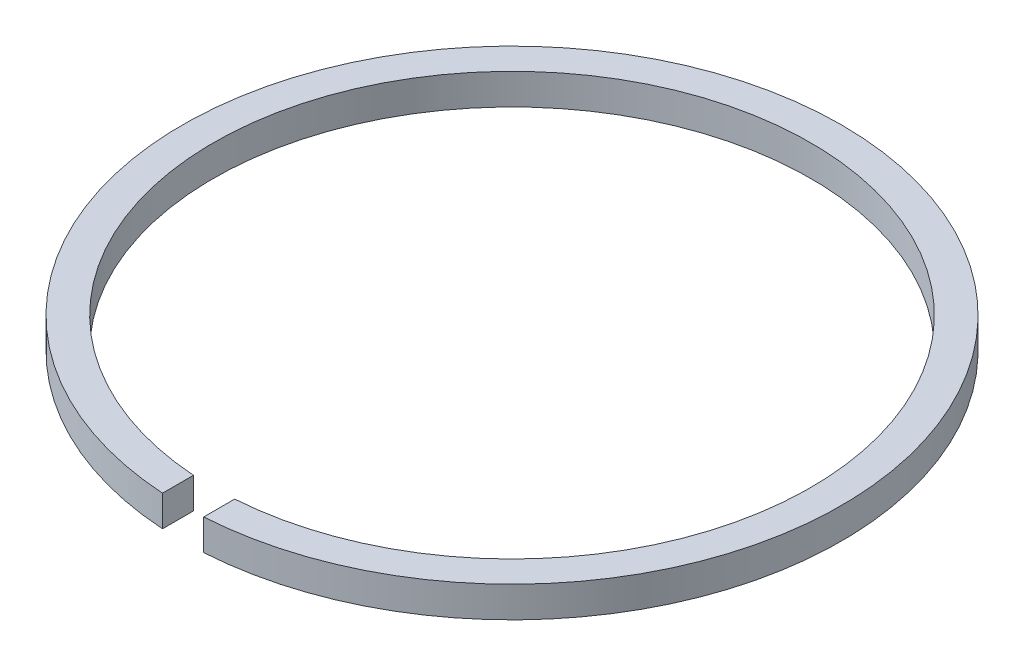
ISO-10303-21;
HEADER;
FILE_DESCRIPTION(('STEP AP214'),'2;1');
FILE_NAME('part.step','',(''),(''),'','','');
FILE_SCHEMA(('AUTOMOTIVE_DESIGN { 1 0 10303 214 1 1 1 1 }'));
ENDSEC;
DATA;
#1=APPLICATION_CONTEXT('core data for automotive mechanical design processes');
#2=APPLICATION_PROTOCOL_DEFINITION('international standard','automotive_design',2000,#1);
#3=PRODUCT_CONTEXT('',#1,'mechanical');
#4=PRODUCT('Part','Part','',(#3));
#5=PRODUCT_RELATED_PRODUCT_CATEGORY('part','',(#4));
#6=PRODUCT_DEFINITION_FORMATION('','',#4);
#7=PRODUCT_DEFINITION_CONTEXT('part definition',#1,'design');
#8=PRODUCT_DEFINITION('design','',#6,#7);
#9=PRODUCT_DEFINITION_SHAPE('','',#8);
#10=(LENGTH_UNIT() NAMED_UNIT(*) SI_UNIT(.MILLI.,.METRE.));
#11=(NAMED_UNIT(*) PLANE_ANGLE_UNIT() SI_UNIT($,.RADIAN.));
#12=(NAMED_UNIT(*) SI_UNIT($,.STERADIAN.) SOLID_ANGLE_UNIT());
#13=UNCERTAINTY_MEASURE_WITH_UNIT(LENGTH_MEASURE(1.E-05),#10,'distance_accuracy_value','');
#14=(GEOMETRIC_REPRESENTATION_CONTEXT(3) GLOBAL_UNCERTAINTY_ASSIGNED_CONTEXT((#13)) GLOBAL_UNIT_ASSIGNED_CONTEXT((#10,
#11,#12)) REPRESENTATION_CONTEXT('',''));
#15=CARTESIAN_POINT('',(0.,0.,0.));
#16=DIRECTION('',(0.,0.,1.));
#17=DIRECTION('',(1.,0.,0.));
#18=AXIS2_PLACEMENT_3D('',#15,#16,#17);
#19=CARTESIAN_POINT('',(0.,1.5,0.));
#20=DIRECTION('',(0.,-1.,0.));
#21=DIRECTION('',(0.,0.,-1.));
#22=AXIS2_PLACEMENT_3D('',#19,#20,#21);
#23=CYLINDRICAL_SURFACE('',#22,14.5);
#24=CARTESIAN_POINT('',(0.,0.,0.));
#25=DIRECTION('',(0.,-1.,0.));
#26=DIRECTION('',(0.,0.,1.));
#27=AXIS2_PLACEMENT_3D('',#24,#25,#26);
#28=CIRCLE('',#27,14.5);
#29=CARTESIAN_POINT('',(-0.999999999999998,0.,14.4654761414894));
#30=VERTEX_POINT('',#29);
#31=CARTESIAN_POINT('',(1.,0.,14.4654761414894));
#32=VERTEX_POINT('',#31);
#33=EDGE_CURVE('E104',#30,#32,#28,.T.);
#34=ORIENTED_EDGE('',*,*,#33,.T.);
#35=DIRECTION('',(0.,-1.,0.));
#36=VECTOR('',#35,1.);
#37=CARTESIAN_POINT('',(1.,1.5,14.4654761414894));
#38=LINE('',#37,#36);
#39=CARTESIAN_POINT('',(1.,1.5,14.4654761414894));
#40=VERTEX_POINT('',#39);
#41=EDGE_CURVE('E11',#40,#32,#38,.T.);
#42=ORIENTED_EDGE('',*,*,#41,.F.);
#43=CARTESIAN_POINT('',(0.,1.5,0.));
#44=DIRECTION('',(0.,-1.,0.));
#45=DIRECTION('',(0.,0.,1.));
#46=AXIS2_PLACEMENT_3D('',#43,#44,#45);
#47=CIRCLE('',#46,14.5);
#48=CARTESIAN_POINT('',(-0.999999999999998,1.5,14.4654761414894));
#49=VERTEX_POINT('',#48);
#50=EDGE_CURVE('E92',#49,#40,#47,.T.);
#51=ORIENTED_EDGE('',*,*,#50,.F.);
#52=DIRECTION('',(0.,-1.,0.));
#53=VECTOR('',#52,1.);
#54=CARTESIAN_POINT('',(-0.999999999999998,1.5,14.4654761414894));
#55=LINE('',#54,#53);
#56=EDGE_CURVE('E100',#49,#30,#55,.T.);
#57=ORIENTED_EDGE('',*,*,#56,.T.);
#58=EDGE_LOOP('',(#34,#42,#51,#57));
#59=FACE_BOUND('',#58,.T.);
#60=ADVANCED_FACE('F41',(#59),#23,.F.);
#61=CARTESIAN_POINT('',(1.,1.5,14.4654761414894));
#62=DIRECTION('',(1.,0.,0.));
#63=DIRECTION('',(0.,0.,-1.));
#64=AXIS2_PLACEMENT_3D('',#61,#62,#63);
#65=PLANE('',#64);
#66=DIRECTION('',(0.,0.,1.));
#67=VECTOR('',#66,1.);
#68=CARTESIAN_POINT('',(1.,0.,14.4654761414894));
#69=LINE('',#68,#67);
#70=CARTESIAN_POINT('',(1.,0.,15.9687194226713));
#71=VERTEX_POINT('',#70);
#72=EDGE_CURVE('E96',#32,#71,#69,.T.);
#73=ORIENTED_EDGE('',*,*,#72,.T.);
#74=DIRECTION('',(0.,-1.,0.));
#75=VECTOR('',#74,1.);
#76=CARTESIAN_POINT('',(1.,1.5,15.9687194226713));
#77=LINE('',#76,#75);
#78=CARTESIAN_POINT('',(1.,1.5,15.9687194226713));
#79=VERTEX_POINT('',#78);
#80=EDGE_CURVE('E49',#79,#71,#77,.T.);
#81=ORIENTED_EDGE('',*,*,#80,.F.);
#82=DIRECTION('',(0.,0.,1.));
#83=VECTOR('',#82,1.);
#84=CARTESIAN_POINT('',(1.,1.5,14.4654761414894));
#85=LINE('',#84,#83);
#86=EDGE_CURVE('E87',#40,#79,#85,.T.);
#87=ORIENTED_EDGE('',*,*,#86,.F.);
#88=ORIENTED_EDGE('',*,*,#41,.T.);
#89=EDGE_LOOP('',(#73,#81,#87,#88));
#90=FACE_BOUND('',#89,.T.);
#91=ADVANCED_FACE('F95',(#90),#65,.F.);
#92=CARTESIAN_POINT('',(0.,1.5,0.));
#93=DIRECTION('',(0.,-1.,0.));
#94=DIRECTION('',(0.,0.,-1.));
#95=AXIS2_PLACEMENT_3D('',#92,#93,#94);
#96=CYLINDRICAL_SURFACE('',#95,16.);
#97=CARTESIAN_POINT('',(0.,0.,0.));
#98=DIRECTION('',(0.,1.,0.));
#99=DIRECTION('',(0.,0.,1.));
#100=AXIS2_PLACEMENT_3D('',#97,#98,#99);
#101=CIRCLE('',#100,16.);
#102=CARTESIAN_POINT('',(-0.999999999999998,0.,15.9687194226713));
#103=VERTEX_POINT('',#102);
#104=EDGE_CURVE('E74',#71,#103,#101,.T.);
#105=ORIENTED_EDGE('',*,*,#104,.T.);
#106=DIRECTION('',(0.,-1.,0.));
#107=VECTOR('',#106,1.);
#108=CARTESIAN_POINT('',(-0.999999999999998,1.5,15.9687194226713));
#109=LINE('',#108,#107);
#110=CARTESIAN_POINT('',(-0.999999999999998,1.5,15.9687194226713));
#111=VERTEX_POINT('',#110);
#112=EDGE_CURVE('E97',#111,#103,#109,.T.);
#113=ORIENTED_EDGE('',*,*,#112,.F.);
#114=CARTESIAN_POINT('',(0.,1.5,0.));
#115=DIRECTION('',(0.,1.,0.));
#116=DIRECTION('',(0.,0.,1.));
#117=AXIS2_PLACEMENT_3D('',#114,#115,#116);
#118=CIRCLE('',#117,16.);
#119=EDGE_CURVE('E90',#79,#111,#118,.T.);
#120=ORIENTED_EDGE('',*,*,#119,.F.);
#121=ORIENTED_EDGE('',*,*,#80,.T.);
#122=EDGE_LOOP('',(#105,#113,#120,#121));
#123=FACE_BOUND('',#122,.T.);
#124=ADVANCED_FACE('F98',(#123),#96,.T.);
#125=CARTESIAN_POINT('',(-0.999999999999998,1.5,14.4654761414894));
#126=DIRECTION('',(-1.,0.,0.));
#127=DIRECTION('',(0.,0.,1.));
#128=AXIS2_PLACEMENT_3D('',#125,#126,#127);
#129=PLANE('',#128);
#130=DIRECTION('',(0.,0.,-1.));
#131=VECTOR('',#130,1.);
#132=CARTESIAN_POINT('',(-0.999999999999998,0.,14.4654761414894));
#133=LINE('',#132,#131);
#134=EDGE_CURVE('E80',#103,#30,#133,.T.);
#135=ORIENTED_EDGE('',*,*,#134,.T.);
#136=ORIENTED_EDGE('',*,*,#56,.F.);
#137=DIRECTION('',(0.,0.,-1.));
#138=VECTOR('',#137,1.);
#139=CARTESIAN_POINT('',(-0.999999999999998,1.5,14.4654761414894));
#140=LINE('',#139,#138);
#141=EDGE_CURVE('E57',#111,#49,#140,.T.);
#142=ORIENTED_EDGE('',*,*,#141,.F.);
#143=ORIENTED_EDGE('',*,*,#112,.T.);
#144=EDGE_LOOP('',(#135,#136,#142,#143));
#145=FACE_BOUND('',#144,.T.);
#146=ADVANCED_FACE('F111',(#145),#129,.F.);
#147=CARTESIAN_POINT('',(0.,1.5,0.));
#148=DIRECTION('',(0.,1.,0.));
#149=DIRECTION('',(0.,0.,1.));
#150=AXIS2_PLACEMENT_3D('',#147,#148,#149);
#151=PLANE('',#150);
#152=ORIENTED_EDGE('',*,*,#50,.T.);
#153=ORIENTED_EDGE('',*,*,#86,.T.);
#154=ORIENTED_EDGE('',*,*,#119,.T.);
#155=ORIENTED_EDGE('',*,*,#141,.T.);
#156=EDGE_LOOP('',(#152,#153,#154,#155));
#157=FACE_BOUND('',#156,.T.);
#158=ADVANCED_FACE('F88',(#157),#151,.T.);
#159=CARTESIAN_POINT('',(0.,0.,0.));
#160=DIRECTION('',(0.,1.,0.));
#161=DIRECTION('',(0.,0.,1.));
#162=AXIS2_PLACEMENT_3D('',#159,#160,#161);
#163=PLANE('',#162);
#164=ORIENTED_EDGE('',*,*,#33,.F.);
#165=ORIENTED_EDGE('',*,*,#134,.F.);
#166=ORIENTED_EDGE('',*,*,#104,.F.);
#167=ORIENTED_EDGE('',*,*,#72,.F.);
#168=EDGE_LOOP('',(#164,#165,#166,#167));
#169=FACE_BOUND('',#168,.T.);
#170=ADVANCED_FACE('F114',(#169),#163,.F.);
#171=CLOSED_SHELL('',(#60,#91,#124,#146,#158,#170));
#172=MANIFOLD_SOLID_BREP('B2',#171);
#173=ADVANCED_BREP_SHAPE_REPRESENTATION('',(#18,#172),#14);
#174=SHAPE_DEFINITION_REPRESENTATION(#9,#173);
ENDSEC;
END-ISO-10303-21;
